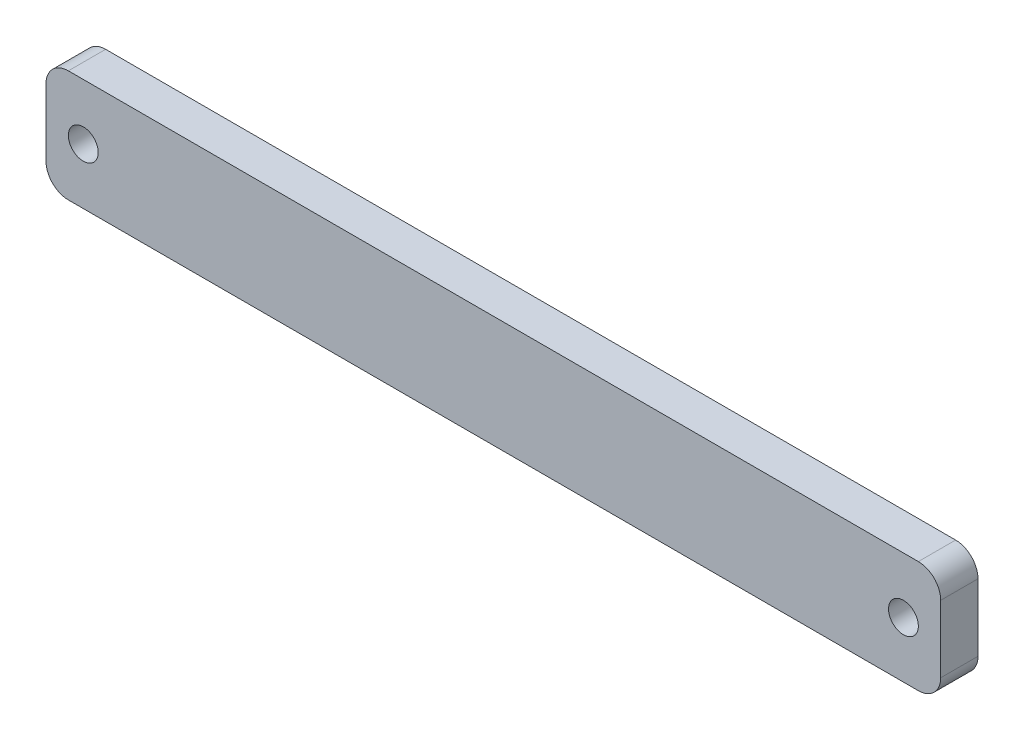
ISO-10303-21;
HEADER;
FILE_DESCRIPTION(('STEP AP214'),'2;1');
FILE_NAME('part.step','',(''),(''),'','','');
FILE_SCHEMA(('AUTOMOTIVE_DESIGN { 1 0 10303 214 1 1 1 1 }'));
ENDSEC;
DATA;
#1=APPLICATION_CONTEXT('core data for automotive mechanical design processes');
#2=APPLICATION_PROTOCOL_DEFINITION('international standard','automotive_design',2000,#1);
#3=PRODUCT_CONTEXT('',#1,'mechanical');
#4=PRODUCT('Part','Part','',(#3));
#5=PRODUCT_RELATED_PRODUCT_CATEGORY('part','',(#4));
#6=PRODUCT_DEFINITION_FORMATION('','',#4);
#7=PRODUCT_DEFINITION_CONTEXT('part definition',#1,'design');
#8=PRODUCT_DEFINITION('design','',#6,#7);
#9=PRODUCT_DEFINITION_SHAPE('','',#8);
#10=(LENGTH_UNIT() NAMED_UNIT(*) SI_UNIT(.MILLI.,.METRE.));
#11=(NAMED_UNIT(*) PLANE_ANGLE_UNIT() SI_UNIT($,.RADIAN.));
#12=(NAMED_UNIT(*) SI_UNIT($,.STERADIAN.) SOLID_ANGLE_UNIT());
#13=UNCERTAINTY_MEASURE_WITH_UNIT(LENGTH_MEASURE(1.E-05),#10,'distance_accuracy_value','');
#14=(GEOMETRIC_REPRESENTATION_CONTEXT(3) GLOBAL_UNCERTAINTY_ASSIGNED_CONTEXT((#13)) GLOBAL_UNIT_ASSIGNED_CONTEXT((#10,
#11,#12)) REPRESENTATION_CONTEXT('',''));
#15=CARTESIAN_POINT('',(0.,0.,0.));
#16=DIRECTION('',(0.,0.,1.));
#17=DIRECTION('',(1.,0.,0.));
#18=AXIS2_PLACEMENT_3D('',#15,#16,#17);
#19=CARTESIAN_POINT('',(0.,0.,5.));
#20=DIRECTION('',(0.,0.,1.));
#21=DIRECTION('',(1.,0.,0.));
#22=AXIS2_PLACEMENT_3D('',#19,#20,#21);
#23=PLANE('',#22);
#24=CARTESIAN_POINT('',(-55.,0.,5.));
#25=DIRECTION('',(0.,0.,1.));
#26=DIRECTION('',(1.,0.,0.));
#27=AXIS2_PLACEMENT_3D('',#24,#25,#26);
#28=CIRCLE('',#27,2.);
#29=CARTESIAN_POINT('',(-53.,0.,5.));
#30=VERTEX_POINT('',#29);
#31=EDGE_CURVE('E179',#30,#30,#28,.T.);
#32=ORIENTED_EDGE('',*,*,#31,.F.);
#33=EDGE_LOOP('',(#32));
#34=FACE_BOUND('',#33,.T.);
#35=DIRECTION('',(0.,-1.,0.));
#36=VECTOR('',#35,1.);
#37=CARTESIAN_POINT('',(-60.,7.5,5.));
#38=LINE('',#37,#36);
#39=CARTESIAN_POINT('',(-60.,4.5,5.));
#40=VERTEX_POINT('',#39);
#41=CARTESIAN_POINT('',(-60.,-4.5,5.));
#42=VERTEX_POINT('',#41);
#43=EDGE_CURVE('E183',#40,#42,#38,.T.);
#44=ORIENTED_EDGE('',*,*,#43,.T.);
#45=CARTESIAN_POINT('',(-57.,-4.5,5.));
#46=DIRECTION('',(0.,0.,1.));
#47=DIRECTION('',(1.,0.,0.));
#48=AXIS2_PLACEMENT_3D('',#45,#46,#47);
#49=CIRCLE('',#48,3.);
#50=CARTESIAN_POINT('',(-57.,-7.5,5.));
#51=VERTEX_POINT('',#50);
#52=EDGE_CURVE('E160',#42,#51,#49,.T.);
#53=ORIENTED_EDGE('',*,*,#52,.T.);
#54=DIRECTION('',(1.,0.,0.));
#55=VECTOR('',#54,1.);
#56=CARTESIAN_POINT('',(-60.,-7.5,5.));
#57=LINE('',#56,#55);
#58=CARTESIAN_POINT('',(57.,-7.5,5.));
#59=VERTEX_POINT('',#58);
#60=EDGE_CURVE('E131',#51,#59,#57,.T.);
#61=ORIENTED_EDGE('',*,*,#60,.T.);
#62=CARTESIAN_POINT('',(57.,-4.5,5.));
#63=DIRECTION('',(0.,0.,1.));
#64=DIRECTION('',(1.,0.,0.));
#65=AXIS2_PLACEMENT_3D('',#62,#63,#64);
#66=CIRCLE('',#65,3.);
#67=CARTESIAN_POINT('',(60.,-4.5,5.));
#68=VERTEX_POINT('',#67);
#69=EDGE_CURVE('E156',#59,#68,#66,.T.);
#70=ORIENTED_EDGE('',*,*,#69,.T.);
#71=DIRECTION('',(0.,1.,0.));
#72=VECTOR('',#71,1.);
#73=CARTESIAN_POINT('',(60.,7.5,5.));
#74=LINE('',#73,#72);
#75=CARTESIAN_POINT('',(60.,4.5,5.));
#76=VERTEX_POINT('',#75);
#77=EDGE_CURVE('E139',#68,#76,#74,.T.);
#78=ORIENTED_EDGE('',*,*,#77,.T.);
#79=CARTESIAN_POINT('',(57.,4.5,5.));
#80=DIRECTION('',(0.,0.,1.));
#81=DIRECTION('',(1.,0.,0.));
#82=AXIS2_PLACEMENT_3D('',#79,#80,#81);
#83=CIRCLE('',#82,3.);
#84=CARTESIAN_POINT('',(57.,7.5,5.));
#85=VERTEX_POINT('',#84);
#86=EDGE_CURVE('E66',#76,#85,#83,.T.);
#87=ORIENTED_EDGE('',*,*,#86,.T.);
#88=DIRECTION('',(-1.,0.,0.));
#89=VECTOR('',#88,1.);
#90=CARTESIAN_POINT('',(-60.,7.5,5.));
#91=LINE('',#90,#89);
#92=CARTESIAN_POINT('',(-57.,7.5,5.));
#93=VERTEX_POINT('',#92);
#94=EDGE_CURVE('E142',#85,#93,#91,.T.);
#95=ORIENTED_EDGE('',*,*,#94,.T.);
#96=CARTESIAN_POINT('',(-57.,4.5,5.));
#97=DIRECTION('',(0.,0.,1.));
#98=DIRECTION('',(1.,0.,0.));
#99=AXIS2_PLACEMENT_3D('',#96,#97,#98);
#100=CIRCLE('',#99,3.);
#101=EDGE_CURVE('E158',#93,#40,#100,.T.);
#102=ORIENTED_EDGE('',*,*,#101,.T.);
#103=EDGE_LOOP('',(#44,#53,#61,#70,#78,#87,#95,#102));
#104=FACE_BOUND('',#103,.T.);
#105=CARTESIAN_POINT('',(55.,0.,5.));
#106=DIRECTION('',(0.,0.,1.));
#107=DIRECTION('',(-1.,0.,0.));
#108=AXIS2_PLACEMENT_3D('',#105,#106,#107);
#109=CIRCLE('',#108,2.);
#110=CARTESIAN_POINT('',(53.,0.,5.));
#111=VERTEX_POINT('',#110);
#112=EDGE_CURVE('E189',#111,#111,#109,.T.);
#113=ORIENTED_EDGE('',*,*,#112,.F.);
#114=EDGE_LOOP('',(#113));
#115=FACE_BOUND('',#114,.T.);
#116=ADVANCED_FACE('F44',(#34,#104,#115),#23,.T.);
#117=CARTESIAN_POINT('',(0.,0.,0.));
#118=DIRECTION('',(0.,0.,1.));
#119=DIRECTION('',(1.,0.,0.));
#120=AXIS2_PLACEMENT_3D('',#117,#118,#119);
#121=PLANE('',#120);
#122=DIRECTION('',(1.,0.,0.));
#123=VECTOR('',#122,1.);
#124=CARTESIAN_POINT('',(-60.,-7.5,0.));
#125=LINE('',#124,#123);
#126=CARTESIAN_POINT('',(-57.,-7.5,0.));
#127=VERTEX_POINT('',#126);
#128=CARTESIAN_POINT('',(57.,-7.5,0.));
#129=VERTEX_POINT('',#128);
#130=EDGE_CURVE('E128',#127,#129,#125,.T.);
#131=ORIENTED_EDGE('',*,*,#130,.F.);
#132=CARTESIAN_POINT('',(-57.,-4.5,0.));
#133=DIRECTION('',(0.,0.,1.));
#134=DIRECTION('',(1.,0.,0.));
#135=AXIS2_PLACEMENT_3D('',#132,#133,#134);
#136=CIRCLE('',#135,3.);
#137=CARTESIAN_POINT('',(-60.,-4.5,0.));
#138=VERTEX_POINT('',#137);
#139=EDGE_CURVE('E111',#127,#138,#136,.F.);
#140=ORIENTED_EDGE('',*,*,#139,.T.);
#141=DIRECTION('',(0.,-1.,0.));
#142=VECTOR('',#141,1.);
#143=CARTESIAN_POINT('',(-60.,7.5,0.));
#144=LINE('',#143,#142);
#145=CARTESIAN_POINT('',(-60.,4.5,0.));
#146=VERTEX_POINT('',#145);
#147=EDGE_CURVE('E140',#146,#138,#144,.T.);
#148=ORIENTED_EDGE('',*,*,#147,.F.);
#149=CARTESIAN_POINT('',(-57.,4.5,0.));
#150=DIRECTION('',(0.,0.,1.));
#151=DIRECTION('',(1.,0.,0.));
#152=AXIS2_PLACEMENT_3D('',#149,#150,#151);
#153=CIRCLE('',#152,3.);
#154=CARTESIAN_POINT('',(-57.,7.5,0.));
#155=VERTEX_POINT('',#154);
#156=EDGE_CURVE('E122',#146,#155,#153,.F.);
#157=ORIENTED_EDGE('',*,*,#156,.T.);
#158=DIRECTION('',(-1.,0.,0.));
#159=VECTOR('',#158,1.);
#160=CARTESIAN_POINT('',(-60.,7.5,0.));
#161=LINE('',#160,#159);
#162=CARTESIAN_POINT('',(57.,7.5,0.));
#163=VERTEX_POINT('',#162);
#164=EDGE_CURVE('E144',#163,#155,#161,.T.);
#165=ORIENTED_EDGE('',*,*,#164,.F.);
#166=CARTESIAN_POINT('',(57.,4.5,0.));
#167=DIRECTION('',(0.,0.,1.));
#168=DIRECTION('',(1.,0.,0.));
#169=AXIS2_PLACEMENT_3D('',#166,#167,#168);
#170=CIRCLE('',#169,3.);
#171=CARTESIAN_POINT('',(60.,4.5,0.));
#172=VERTEX_POINT('',#171);
#173=EDGE_CURVE('E132',#163,#172,#170,.F.);
#174=ORIENTED_EDGE('',*,*,#173,.T.);
#175=DIRECTION('',(0.,1.,0.));
#176=VECTOR('',#175,1.);
#177=CARTESIAN_POINT('',(60.,7.5,0.));
#178=LINE('',#177,#176);
#179=CARTESIAN_POINT('',(60.,-4.5,0.));
#180=VERTEX_POINT('',#179);
#181=EDGE_CURVE('E171',#180,#172,#178,.T.);
#182=ORIENTED_EDGE('',*,*,#181,.F.);
#183=CARTESIAN_POINT('',(57.,-4.5,0.));
#184=DIRECTION('',(0.,0.,1.));
#185=DIRECTION('',(1.,0.,0.));
#186=AXIS2_PLACEMENT_3D('',#183,#184,#185);
#187=CIRCLE('',#186,3.);
#188=EDGE_CURVE('E138',#180,#129,#187,.F.);
#189=ORIENTED_EDGE('',*,*,#188,.T.);
#190=EDGE_LOOP('',(#131,#140,#148,#157,#165,#174,#182,#189));
#191=FACE_BOUND('',#190,.T.);
#192=CARTESIAN_POINT('',(-55.,0.,0.));
#193=DIRECTION('',(0.,0.,1.));
#194=DIRECTION('',(1.,0.,0.));
#195=AXIS2_PLACEMENT_3D('',#192,#193,#194);
#196=CIRCLE('',#195,2.);
#197=CARTESIAN_POINT('',(-53.,0.,0.));
#198=VERTEX_POINT('',#197);
#199=EDGE_CURVE('E186',#198,#198,#196,.T.);
#200=ORIENTED_EDGE('',*,*,#199,.T.);
#201=EDGE_LOOP('',(#200));
#202=FACE_BOUND('',#201,.T.);
#203=CARTESIAN_POINT('',(55.,0.,0.));
#204=DIRECTION('',(0.,0.,1.));
#205=DIRECTION('',(-1.,0.,0.));
#206=AXIS2_PLACEMENT_3D('',#203,#204,#205);
#207=CIRCLE('',#206,2.);
#208=CARTESIAN_POINT('',(53.,0.,0.));
#209=VERTEX_POINT('',#208);
#210=EDGE_CURVE('E192',#209,#209,#207,.T.);
#211=ORIENTED_EDGE('',*,*,#210,.T.);
#212=EDGE_LOOP('',(#211));
#213=FACE_BOUND('',#212,.T.);
#214=ADVANCED_FACE('F135',(#191,#202,#213),#121,.F.);
#215=CARTESIAN_POINT('',(60.,7.5,5.));
#216=DIRECTION('',(-1.,0.,0.));
#217=DIRECTION('',(0.,0.,1.));
#218=AXIS2_PLACEMENT_3D('',#215,#216,#217);
#219=PLANE('',#218);
#220=ORIENTED_EDGE('',*,*,#77,.F.);
#221=DIRECTION('',(0.,0.,-1.));
#222=VECTOR('',#221,1.);
#223=CARTESIAN_POINT('',(60.,-4.5,5.));
#224=LINE('',#223,#222);
#225=EDGE_CURVE('E13',#68,#180,#224,.T.);
#226=ORIENTED_EDGE('',*,*,#225,.T.);
#227=ORIENTED_EDGE('',*,*,#181,.T.);
#228=DIRECTION('',(0.,0.,-1.));
#229=VECTOR('',#228,1.);
#230=CARTESIAN_POINT('',(60.,4.5,5.));
#231=LINE('',#230,#229);
#232=EDGE_CURVE('E52',#172,#76,#231,.F.);
#233=ORIENTED_EDGE('',*,*,#232,.T.);
#234=EDGE_LOOP('',(#220,#226,#227,#233));
#235=FACE_BOUND('',#234,.T.);
#236=ADVANCED_FACE('F169',(#235),#219,.F.);
#237=CARTESIAN_POINT('',(-60.,7.5,5.));
#238=DIRECTION('',(0.,-1.,0.));
#239=DIRECTION('',(0.,0.,-1.));
#240=AXIS2_PLACEMENT_3D('',#237,#238,#239);
#241=PLANE('',#240);
#242=ORIENTED_EDGE('',*,*,#164,.T.);
#243=DIRECTION('',(0.,0.,-1.));
#244=VECTOR('',#243,1.);
#245=CARTESIAN_POINT('',(-57.,7.5,5.));
#246=LINE('',#245,#244);
#247=EDGE_CURVE('E59',#155,#93,#246,.F.);
#248=ORIENTED_EDGE('',*,*,#247,.T.);
#249=ORIENTED_EDGE('',*,*,#94,.F.);
#250=DIRECTION('',(0.,0.,-1.));
#251=VECTOR('',#250,1.);
#252=CARTESIAN_POINT('',(57.,7.5,5.));
#253=LINE('',#252,#251);
#254=EDGE_CURVE('E162',#85,#163,#253,.T.);
#255=ORIENTED_EDGE('',*,*,#254,.T.);
#256=EDGE_LOOP('',(#242,#248,#249,#255));
#257=FACE_BOUND('',#256,.T.);
#258=ADVANCED_FACE('F178',(#257),#241,.F.);
#259=CARTESIAN_POINT('',(-60.,7.5,5.));
#260=DIRECTION('',(1.,0.,0.));
#261=DIRECTION('',(0.,0.,-1.));
#262=AXIS2_PLACEMENT_3D('',#259,#260,#261);
#263=PLANE('',#262);
#264=ORIENTED_EDGE('',*,*,#147,.T.);
#265=DIRECTION('',(0.,0.,-1.));
#266=VECTOR('',#265,1.);
#267=CARTESIAN_POINT('',(-60.,-4.5,5.));
#268=LINE('',#267,#266);
#269=EDGE_CURVE('E116',#138,#42,#268,.F.);
#270=ORIENTED_EDGE('',*,*,#269,.T.);
#271=ORIENTED_EDGE('',*,*,#43,.F.);
#272=DIRECTION('',(0.,0.,-1.));
#273=VECTOR('',#272,1.);
#274=CARTESIAN_POINT('',(-60.,4.5,5.));
#275=LINE('',#274,#273);
#276=EDGE_CURVE('E121',#40,#146,#275,.T.);
#277=ORIENTED_EDGE('',*,*,#276,.T.);
#278=EDGE_LOOP('',(#264,#270,#271,#277));
#279=FACE_BOUND('',#278,.T.);
#280=ADVANCED_FACE('F214',(#279),#263,.F.);
#281=CARTESIAN_POINT('',(-60.,-7.5,5.));
#282=DIRECTION('',(0.,1.,0.));
#283=DIRECTION('',(0.,0.,1.));
#284=AXIS2_PLACEMENT_3D('',#281,#282,#283);
#285=PLANE('',#284);
#286=ORIENTED_EDGE('',*,*,#60,.F.);
#287=DIRECTION('',(0.,0.,-1.));
#288=VECTOR('',#287,1.);
#289=CARTESIAN_POINT('',(-57.,-7.5,5.));
#290=LINE('',#289,#288);
#291=EDGE_CURVE('E115',#51,#127,#290,.T.);
#292=ORIENTED_EDGE('',*,*,#291,.T.);
#293=ORIENTED_EDGE('',*,*,#130,.T.);
#294=DIRECTION('',(0.,0.,-1.));
#295=VECTOR('',#294,1.);
#296=CARTESIAN_POINT('',(57.,-7.5,5.));
#297=LINE('',#296,#295);
#298=EDGE_CURVE('E133',#129,#59,#297,.F.);
#299=ORIENTED_EDGE('',*,*,#298,.T.);
#300=EDGE_LOOP('',(#286,#292,#293,#299));
#301=FACE_BOUND('',#300,.T.);
#302=ADVANCED_FACE('F127',(#301),#285,.F.);
#303=CARTESIAN_POINT('',(-55.,0.,5.));
#304=DIRECTION('',(0.,0.,-1.));
#305=DIRECTION('',(-1.,0.,0.));
#306=AXIS2_PLACEMENT_3D('',#303,#304,#305);
#307=CYLINDRICAL_SURFACE('',#306,2.);
#308=ORIENTED_EDGE('',*,*,#31,.T.);
#309=EDGE_LOOP('',(#308));
#310=FACE_BOUND('',#309,.T.);
#311=ORIENTED_EDGE('',*,*,#199,.F.);
#312=EDGE_LOOP('',(#311));
#313=FACE_BOUND('',#312,.T.);
#314=ADVANCED_FACE('F209',(#310,#313),#307,.F.);
#315=CARTESIAN_POINT('',(55.,0.,5.));
#316=DIRECTION('',(0.,0.,-1.));
#317=DIRECTION('',(-1.,0.,0.));
#318=AXIS2_PLACEMENT_3D('',#315,#316,#317);
#319=CYLINDRICAL_SURFACE('',#318,2.);
#320=ORIENTED_EDGE('',*,*,#112,.T.);
#321=EDGE_LOOP('',(#320));
#322=FACE_BOUND('',#321,.T.);
#323=ORIENTED_EDGE('',*,*,#210,.F.);
#324=EDGE_LOOP('',(#323));
#325=FACE_BOUND('',#324,.T.);
#326=ADVANCED_FACE('F198',(#322,#325),#319,.F.);
#327=CARTESIAN_POINT('',(-57.,-4.5,5.));
#328=DIRECTION('',(0.,0.,-1.));
#329=DIRECTION('',(-1.,0.,0.));
#330=AXIS2_PLACEMENT_3D('',#327,#328,#329);
#331=CYLINDRICAL_SURFACE('',#330,3.);
#332=ORIENTED_EDGE('',*,*,#52,.F.);
#333=ORIENTED_EDGE('',*,*,#269,.F.);
#334=ORIENTED_EDGE('',*,*,#139,.F.);
#335=ORIENTED_EDGE('',*,*,#291,.F.);
#336=EDGE_LOOP('',(#332,#333,#334,#335));
#337=FACE_BOUND('',#336,.T.);
#338=ADVANCED_FACE('F114',(#337),#331,.T.);
#339=CARTESIAN_POINT('',(-57.,4.5,5.));
#340=DIRECTION('',(0.,0.,-1.));
#341=DIRECTION('',(-1.,0.,0.));
#342=AXIS2_PLACEMENT_3D('',#339,#340,#341);
#343=CYLINDRICAL_SURFACE('',#342,3.);
#344=ORIENTED_EDGE('',*,*,#101,.F.);
#345=ORIENTED_EDGE('',*,*,#247,.F.);
#346=ORIENTED_EDGE('',*,*,#156,.F.);
#347=ORIENTED_EDGE('',*,*,#276,.F.);
#348=EDGE_LOOP('',(#344,#345,#346,#347));
#349=FACE_BOUND('',#348,.T.);
#350=ADVANCED_FACE('F224',(#349),#343,.T.);
#351=CARTESIAN_POINT('',(57.,-4.5,5.));
#352=DIRECTION('',(0.,0.,-1.));
#353=DIRECTION('',(-1.,0.,0.));
#354=AXIS2_PLACEMENT_3D('',#351,#352,#353);
#355=CYLINDRICAL_SURFACE('',#354,3.);
#356=ORIENTED_EDGE('',*,*,#69,.F.);
#357=ORIENTED_EDGE('',*,*,#298,.F.);
#358=ORIENTED_EDGE('',*,*,#188,.F.);
#359=ORIENTED_EDGE('',*,*,#225,.F.);
#360=EDGE_LOOP('',(#356,#357,#358,#359));
#361=FACE_BOUND('',#360,.T.);
#362=ADVANCED_FACE('F226',(#361),#355,.T.);
#363=CARTESIAN_POINT('',(57.,4.5,5.));
#364=DIRECTION('',(0.,0.,-1.));
#365=DIRECTION('',(-1.,0.,0.));
#366=AXIS2_PLACEMENT_3D('',#363,#364,#365);
#367=CYLINDRICAL_SURFACE('',#366,3.);
#368=ORIENTED_EDGE('',*,*,#86,.F.);
#369=ORIENTED_EDGE('',*,*,#232,.F.);
#370=ORIENTED_EDGE('',*,*,#173,.F.);
#371=ORIENTED_EDGE('',*,*,#254,.F.);
#372=EDGE_LOOP('',(#368,#369,#370,#371));
#373=FACE_BOUND('',#372,.T.);
#374=ADVANCED_FACE('F46',(#373),#367,.T.);
#375=CLOSED_SHELL('',(#116,#214,#236,#258,#280,#302,#314,#326,#338,#350,#362,#374));
#376=MANIFOLD_SOLID_BREP('B2',#375);
#377=ADVANCED_BREP_SHAPE_REPRESENTATION('',(#18,#376),#14);
#378=SHAPE_DEFINITION_REPRESENTATION(#9,#377);
ENDSEC;
END-ISO-10303-21;
